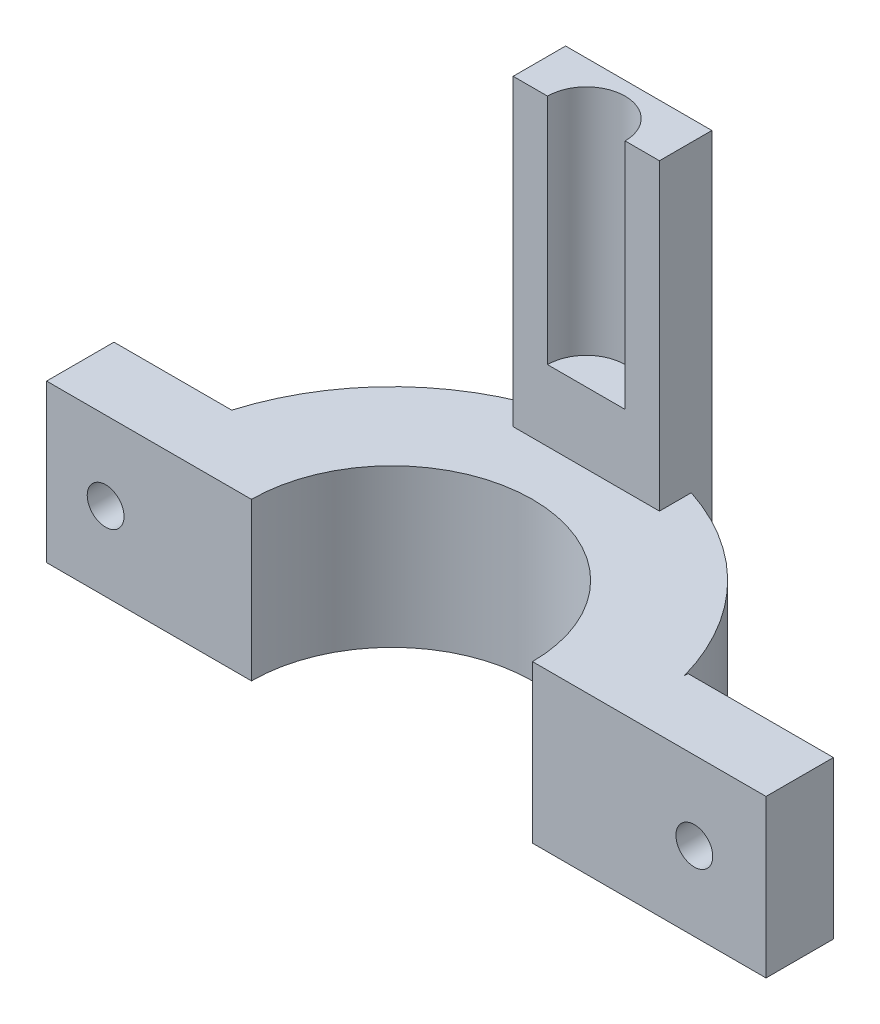
ISO-10303-21;
HEADER;
FILE_DESCRIPTION(('STEP AP214'),'2;1');
FILE_NAME('part.step','',(''),(''),'','','');
FILE_SCHEMA(('AUTOMOTIVE_DESIGN { 1 0 10303 214 1 1 1 1 }'));
ENDSEC;
DATA;
#1=APPLICATION_CONTEXT('core data for automotive mechanical design processes');
#2=APPLICATION_PROTOCOL_DEFINITION('international standard','automotive_design',2000,#1);
#3=PRODUCT_CONTEXT('',#1,'mechanical');
#4=PRODUCT('Part','Part','',(#3));
#5=PRODUCT_RELATED_PRODUCT_CATEGORY('part','',(#4));
#6=PRODUCT_DEFINITION_FORMATION('','',#4);
#7=PRODUCT_DEFINITION_CONTEXT('part definition',#1,'design');
#8=PRODUCT_DEFINITION('design','',#6,#7);
#9=PRODUCT_DEFINITION_SHAPE('','',#8);
#10=(LENGTH_UNIT() NAMED_UNIT(*) SI_UNIT(.MILLI.,.METRE.));
#11=(NAMED_UNIT(*) PLANE_ANGLE_UNIT() SI_UNIT($,.RADIAN.));
#12=(NAMED_UNIT(*) SI_UNIT($,.STERADIAN.) SOLID_ANGLE_UNIT());
#13=UNCERTAINTY_MEASURE_WITH_UNIT(LENGTH_MEASURE(1.E-05),#10,'distance_accuracy_value','');
#14=(GEOMETRIC_REPRESENTATION_CONTEXT(3) GLOBAL_UNCERTAINTY_ASSIGNED_CONTEXT((#13)) GLOBAL_UNIT_ASSIGNED_CONTEXT((#10,
#11,#12)) REPRESENTATION_CONTEXT('',''));
#15=CARTESIAN_POINT('',(0.,0.,0.));
#16=DIRECTION('',(0.,0.,1.));
#17=DIRECTION('',(1.,0.,0.));
#18=AXIS2_PLACEMENT_3D('',#15,#16,#17);
#19=CARTESIAN_POINT('',(-27.351479578733,-58.59,0.));
#20=DIRECTION('',(0.,-1.,0.));
#21=DIRECTION('',(0.,0.,-1.));
#22=AXIS2_PLACEMENT_3D('',#19,#20,#21);
#23=CYLINDRICAL_SURFACE('',#22,24.5);
#24=CARTESIAN_POINT('',(-27.351479578733,-69.769427919111,0.));
#25=DIRECTION('',(0.,1.,0.));
#26=DIRECTION('',(0.,0.,1.));
#27=AXIS2_PLACEMENT_3D('',#24,#25,#26);
#28=CIRCLE('',#27,24.5);
#29=CARTESIAN_POINT('',(-34.8435628196889,-69.769427919111,-23.3263518088575));
#30=VERTEX_POINT('',#29);
#31=CARTESIAN_POINT('',(-19.745,-69.769427919111,-23.2892994402648));
#32=VERTEX_POINT('',#31);
#33=EDGE_CURVE('E312',#30,#32,#28,.F.);
#34=ORIENTED_EDGE('',*,*,#33,.T.);
#35=DIRECTION('',(0.,-1.,0.));
#36=VECTOR('',#35,1.);
#37=CARTESIAN_POINT('',(-19.745,-58.59,-23.2892994402648));
#38=LINE('',#37,#36);
#39=CARTESIAN_POINT('',(-19.745,-58.59,-23.2892994402648));
#40=VERTEX_POINT('',#39);
#41=EDGE_CURVE('E215',#32,#40,#38,.F.);
#42=ORIENTED_EDGE('',*,*,#41,.T.);
#43=CARTESIAN_POINT('',(-27.351479578733,-58.59,0.));
#44=DIRECTION('',(0.,-1.,0.));
#45=DIRECTION('',(1.,0.,0.));
#46=AXIS2_PLACEMENT_3D('',#43,#44,#45);
#47=CIRCLE('',#46,24.5);
#48=CARTESIAN_POINT('',(-3.74499999999999,-58.59,-6.55622771865516));
#49=VERTEX_POINT('',#48);
#50=EDGE_CURVE('E217',#40,#49,#47,.T.);
#51=ORIENTED_EDGE('',*,*,#50,.T.);
#52=DIRECTION('',(0.,-1.,0.));
#53=VECTOR('',#52,1.);
#54=CARTESIAN_POINT('',(-3.745,-58.59,-6.55622771865516));
#55=LINE('',#54,#53);
#56=CARTESIAN_POINT('',(-3.74499999999999,-74.82,-6.55622771865516));
#57=VERTEX_POINT('',#56);
#58=EDGE_CURVE('E232',#57,#49,#55,.F.);
#59=ORIENTED_EDGE('',*,*,#58,.F.);
#60=CARTESIAN_POINT('',(-27.351479578733,-74.82,0.));
#61=DIRECTION('',(0.,-1.,0.));
#62=DIRECTION('',(1.,0.,0.));
#63=AXIS2_PLACEMENT_3D('',#60,#61,#62);
#64=CIRCLE('',#63,24.5);
#65=CARTESIAN_POINT('',(-50.8435628196889,-74.82,-6.95500000000001));
#66=VERTEX_POINT('',#65);
#67=EDGE_CURVE('E241',#66,#57,#64,.T.);
#68=ORIENTED_EDGE('',*,*,#67,.F.);
#69=DIRECTION('',(0.,-1.,0.));
#70=VECTOR('',#69,1.);
#71=CARTESIAN_POINT('',(-50.8435628196889,-58.59,-6.95500000000001));
#72=LINE('',#71,#70);
#73=CARTESIAN_POINT('',(-50.8435628196889,-58.59,-6.95500000000001));
#74=VERTEX_POINT('',#73);
#75=EDGE_CURVE('E227',#74,#66,#72,.T.);
#76=ORIENTED_EDGE('',*,*,#75,.F.);
#77=CARTESIAN_POINT('',(-34.8435628196889,-58.59,-23.3263518088575));
#78=VERTEX_POINT('',#77);
#79=EDGE_CURVE('E258',#74,#78,#47,.T.);
#80=ORIENTED_EDGE('',*,*,#79,.T.);
#81=DIRECTION('',(0.,-1.,0.));
#82=VECTOR('',#81,1.);
#83=CARTESIAN_POINT('',(-34.8435628196889,-58.59,-23.3263518088575));
#84=LINE('',#83,#82);
#85=EDGE_CURVE('E208',#78,#30,#84,.T.);
#86=ORIENTED_EDGE('',*,*,#85,.T.);
#87=EDGE_LOOP('',(#34,#42,#51,#59,#68,#76,#80,#86));
#88=FACE_BOUND('',#87,.T.);
#89=ADVANCED_FACE('F65',(#88),#23,.T.);
#90=CARTESIAN_POINT('',(-3.74499999999999,-58.59,-6.95500000000001));
#91=DIRECTION('',(0.,-1.,0.));
#92=DIRECTION('',(0.,0.,-1.));
#93=AXIS2_PLACEMENT_3D('',#90,#91,#92);
#94=PLANE('',#93);
#95=DIRECTION('',(0.,0.,-1.));
#96=VECTOR('',#95,1.);
#97=CARTESIAN_POINT('',(-19.745,-58.59,-6.95500000000001));
#98=LINE('',#97,#96);
#99=CARTESIAN_POINT('',(-19.745,-58.59,-20.));
#100=VERTEX_POINT('',#99);
#101=EDGE_CURVE('E309',#100,#40,#98,.T.);
#102=ORIENTED_EDGE('',*,*,#101,.F.);
#103=DIRECTION('',(1.,0.,0.));
#104=VECTOR('',#103,1.);
#105=CARTESIAN_POINT('',(-3.74499999999999,-58.59,-20.));
#106=LINE('',#105,#104);
#107=CARTESIAN_POINT('',(-34.8435628196889,-58.59,-20.));
#108=VERTEX_POINT('',#107);
#109=EDGE_CURVE('E221',#108,#100,#106,.T.);
#110=ORIENTED_EDGE('',*,*,#109,.F.);
#111=DIRECTION('',(0.,0.,1.));
#112=VECTOR('',#111,1.);
#113=CARTESIAN_POINT('',(-34.8435628196889,-58.59,-6.95500000000001));
#114=LINE('',#113,#112);
#115=EDGE_CURVE('E307',#78,#108,#114,.T.);
#116=ORIENTED_EDGE('',*,*,#115,.F.);
#117=ORIENTED_EDGE('',*,*,#79,.F.);
#118=DIRECTION('',(1.,0.,0.));
#119=VECTOR('',#118,1.);
#120=CARTESIAN_POINT('',(-63.,-58.59,-6.95500000000001));
#121=LINE('',#120,#119);
#122=CARTESIAN_POINT('',(-63.,-58.59,-6.95500000000001));
#123=VERTEX_POINT('',#122);
#124=EDGE_CURVE('E231',#123,#74,#121,.T.);
#125=ORIENTED_EDGE('',*,*,#124,.F.);
#126=DIRECTION('',(0.,0.,1.));
#127=VECTOR('',#126,1.);
#128=CARTESIAN_POINT('',(-63.,-58.59,-6.95500000000001));
#129=LINE('',#128,#127);
#130=CARTESIAN_POINT('',(-63.,-58.59,0.));
#131=VERTEX_POINT('',#130);
#132=EDGE_CURVE('E280',#123,#131,#129,.T.);
#133=ORIENTED_EDGE('',*,*,#132,.T.);
#134=DIRECTION('',(1.,0.,0.));
#135=VECTOR('',#134,1.);
#136=CARTESIAN_POINT('',(-3.74499999999999,-58.59,0.));
#137=LINE('',#136,#135);
#138=CARTESIAN_POINT('',(-41.851479578733,-58.59,0.));
#139=VERTEX_POINT('',#138);
#140=EDGE_CURVE('E268',#131,#139,#137,.T.);
#141=ORIENTED_EDGE('',*,*,#140,.T.);
#142=CARTESIAN_POINT('',(-27.351479578733,-58.59,0.));
#143=DIRECTION('',(0.,-1.,0.));
#144=DIRECTION('',(0.,0.,-1.));
#145=AXIS2_PLACEMENT_3D('',#142,#143,#144);
#146=CIRCLE('',#145,14.5);
#147=CARTESIAN_POINT('',(-12.851479578733,-58.59,0.));
#148=VERTEX_POINT('',#147);
#149=EDGE_CURVE('E265',#139,#148,#146,.T.);
#150=ORIENTED_EDGE('',*,*,#149,.T.);
#151=CARTESIAN_POINT('',(11.255,-58.59,0.));
#152=VERTEX_POINT('',#151);
#153=EDGE_CURVE('E248',#148,#152,#137,.T.);
#154=ORIENTED_EDGE('',*,*,#153,.T.);
#155=DIRECTION('',(0.,0.,-1.));
#156=VECTOR('',#155,1.);
#157=CARTESIAN_POINT('',(11.255,-58.59,-6.955));
#158=LINE('',#157,#156);
#159=CARTESIAN_POINT('',(11.255,-58.59,-6.955));
#160=VERTEX_POINT('',#159);
#161=EDGE_CURVE('E245',#152,#160,#158,.T.);
#162=ORIENTED_EDGE('',*,*,#161,.T.);
#163=DIRECTION('',(1.,0.,0.));
#164=VECTOR('',#163,1.);
#165=CARTESIAN_POINT('',(-3.74499999999999,-58.59,-6.95500000000001));
#166=LINE('',#165,#164);
#167=CARTESIAN_POINT('',(-3.74499999999999,-58.59,-6.95500000000001));
#168=VERTEX_POINT('',#167);
#169=EDGE_CURVE('E240',#168,#160,#166,.T.);
#170=ORIENTED_EDGE('',*,*,#169,.F.);
#171=DIRECTION('',(0.,0.,-1.));
#172=VECTOR('',#171,1.);
#173=CARTESIAN_POINT('',(-3.74499999999999,-58.59,-6.95500000000001));
#174=LINE('',#173,#172);
#175=EDGE_CURVE('E235',#49,#168,#174,.T.);
#176=ORIENTED_EDGE('',*,*,#175,.F.);
#177=ORIENTED_EDGE('',*,*,#50,.F.);
#178=EDGE_LOOP('',(#102,#110,#116,#117,#125,#133,#141,#150,#154,#162,#170,#176,#177));
#179=FACE_BOUND('',#178,.T.);
#180=ADVANCED_FACE('F347',(#179),#94,.F.);
#181=CARTESIAN_POINT('',(0.,-74.82,0.));
#182=DIRECTION('',(0.,-1.,0.));
#183=DIRECTION('',(0.,0.,-1.));
#184=AXIS2_PLACEMENT_3D('',#181,#182,#183);
#185=PLANE('',#184);
#186=DIRECTION('',(0.,0.,1.));
#187=VECTOR('',#186,1.);
#188=CARTESIAN_POINT('',(11.255,-74.82,-27.));
#189=LINE('',#188,#187);
#190=CARTESIAN_POINT('',(11.255,-74.82,-6.955));
#191=VERTEX_POINT('',#190);
#192=CARTESIAN_POINT('',(11.255,-74.82,0.));
#193=VERTEX_POINT('',#192);
#194=EDGE_CURVE('E261',#191,#193,#189,.T.);
#195=ORIENTED_EDGE('',*,*,#194,.T.);
#196=DIRECTION('',(-1.,0.,0.));
#197=VECTOR('',#196,1.);
#198=CARTESIAN_POINT('',(-63.,-74.82,0.));
#199=LINE('',#198,#197);
#200=CARTESIAN_POINT('',(-12.851479578733,-74.82,0.));
#201=VERTEX_POINT('',#200);
#202=EDGE_CURVE('E300',#193,#201,#199,.T.);
#203=ORIENTED_EDGE('',*,*,#202,.T.);
#204=CARTESIAN_POINT('',(-27.351479578733,-74.82,0.));
#205=DIRECTION('',(0.,-1.,0.));
#206=DIRECTION('',(0.,0.,-1.));
#207=AXIS2_PLACEMENT_3D('',#204,#205,#206);
#208=CIRCLE('',#207,14.5);
#209=CARTESIAN_POINT('',(-41.851479578733,-74.82,0.));
#210=VERTEX_POINT('',#209);
#211=EDGE_CURVE('E255',#210,#201,#208,.T.);
#212=ORIENTED_EDGE('',*,*,#211,.F.);
#213=CARTESIAN_POINT('',(-63.,-74.82,0.));
#214=VERTEX_POINT('',#213);
#215=EDGE_CURVE('E279',#210,#214,#199,.T.);
#216=ORIENTED_EDGE('',*,*,#215,.T.);
#217=DIRECTION('',(0.,0.,-1.));
#218=VECTOR('',#217,1.);
#219=CARTESIAN_POINT('',(-63.,-74.82,-6.95500000000001));
#220=LINE('',#219,#218);
#221=CARTESIAN_POINT('',(-63.,-74.82,-6.95500000000001));
#222=VERTEX_POINT('',#221);
#223=EDGE_CURVE('E277',#214,#222,#220,.T.);
#224=ORIENTED_EDGE('',*,*,#223,.T.);
#225=DIRECTION('',(1.,0.,0.));
#226=VECTOR('',#225,1.);
#227=CARTESIAN_POINT('',(-63.,-74.82,-6.95500000000001));
#228=LINE('',#227,#226);
#229=EDGE_CURVE('E257',#222,#66,#228,.T.);
#230=ORIENTED_EDGE('',*,*,#229,.T.);
#231=ORIENTED_EDGE('',*,*,#67,.T.);
#232=DIRECTION('',(0.,0.,1.));
#233=VECTOR('',#232,1.);
#234=CARTESIAN_POINT('',(-3.74499999999999,-74.82,-6.95500000000001));
#235=LINE('',#234,#233);
#236=CARTESIAN_POINT('',(-3.74499999999999,-74.82,-6.95500000000001));
#237=VERTEX_POINT('',#236);
#238=EDGE_CURVE('E236',#237,#57,#235,.T.);
#239=ORIENTED_EDGE('',*,*,#238,.F.);
#240=DIRECTION('',(1.,0.,0.));
#241=VECTOR('',#240,1.);
#242=CARTESIAN_POINT('',(11.255,-74.82,-6.955));
#243=LINE('',#242,#241);
#244=EDGE_CURVE('E237',#237,#191,#243,.T.);
#245=ORIENTED_EDGE('',*,*,#244,.T.);
#246=EDGE_LOOP('',(#195,#203,#212,#216,#224,#230,#231,#239,#245));
#247=FACE_BOUND('',#246,.T.);
#248=ADVANCED_FACE('F359',(#247),#185,.T.);
#249=CARTESIAN_POINT('',(11.255,-74.82,-6.955));
#250=DIRECTION('',(0.,0.,1.));
#251=DIRECTION('',(1.,0.,0.));
#252=AXIS2_PLACEMENT_3D('',#249,#250,#251);
#253=PLANE('',#252);
#254=CARTESIAN_POINT('',(3.85671364878704,-66.705,-6.955));
#255=DIRECTION('',(0.,0.,-1.));
#256=DIRECTION('',(-1.,0.,0.));
#257=AXIS2_PLACEMENT_3D('',#254,#255,#256);
#258=CIRCLE('',#257,1.9);
#259=CARTESIAN_POINT('',(1.95671364878704,-66.705,-6.955));
#260=VERTEX_POINT('',#259);
#261=EDGE_CURVE('E269',#260,#260,#258,.T.);
#262=ORIENTED_EDGE('',*,*,#261,.F.);
#263=EDGE_LOOP('',(#262));
#264=FACE_BOUND('',#263,.T.);
#265=ORIENTED_EDGE('',*,*,#169,.T.);
#266=DIRECTION('',(0.,-1.,0.));
#267=VECTOR('',#266,1.);
#268=CARTESIAN_POINT('',(11.255,-74.82,-6.955));
#269=LINE('',#268,#267);
#270=EDGE_CURVE('E244',#160,#191,#269,.T.);
#271=ORIENTED_EDGE('',*,*,#270,.T.);
#272=ORIENTED_EDGE('',*,*,#244,.F.);
#273=DIRECTION('',(0.,-1.,0.));
#274=VECTOR('',#273,1.);
#275=CARTESIAN_POINT('',(-3.74499999999999,-74.82,-6.95500000000001));
#276=LINE('',#275,#274);
#277=EDGE_CURVE('E250',#168,#237,#276,.T.);
#278=ORIENTED_EDGE('',*,*,#277,.F.);
#279=EDGE_LOOP('',(#265,#271,#272,#278));
#280=FACE_BOUND('',#279,.T.);
#281=ADVANCED_FACE('F379',(#264,#280),#253,.F.);
#282=CARTESIAN_POINT('',(-3.745,0.,0.));
#283=DIRECTION('',(1.,0.,0.));
#284=DIRECTION('',(0.,0.,-1.));
#285=AXIS2_PLACEMENT_3D('',#282,#283,#284);
#286=PLANE('',#285);
#287=ORIENTED_EDGE('',*,*,#238,.T.);
#288=ORIENTED_EDGE('',*,*,#58,.T.);
#289=ORIENTED_EDGE('',*,*,#175,.T.);
#290=ORIENTED_EDGE('',*,*,#277,.T.);
#291=EDGE_LOOP('',(#287,#288,#289,#290));
#292=FACE_BOUND('',#291,.T.);
#293=ADVANCED_FACE('F355',(#292),#286,.F.);
#294=CARTESIAN_POINT('',(-27.351479578733,-58.59,0.));
#295=DIRECTION('',(0.,-1.,0.));
#296=DIRECTION('',(0.,0.,-1.));
#297=AXIS2_PLACEMENT_3D('',#294,#295,#296);
#298=CYLINDRICAL_SURFACE('',#297,14.5);
#299=ORIENTED_EDGE('',*,*,#211,.T.);
#300=DIRECTION('',(0.,-1.,0.));
#301=VECTOR('',#300,1.);
#302=CARTESIAN_POINT('',(-12.851479578733,-58.59,0.));
#303=LINE('',#302,#301);
#304=EDGE_CURVE('E264',#201,#148,#303,.F.);
#305=ORIENTED_EDGE('',*,*,#304,.T.);
#306=ORIENTED_EDGE('',*,*,#149,.F.);
#307=DIRECTION('',(0.,-1.,0.));
#308=VECTOR('',#307,1.);
#309=CARTESIAN_POINT('',(-41.851479578733,-58.59,0.));
#310=LINE('',#309,#308);
#311=EDGE_CURVE('E289',#139,#210,#310,.T.);
#312=ORIENTED_EDGE('',*,*,#311,.T.);
#313=EDGE_LOOP('',(#299,#305,#306,#312));
#314=FACE_BOUND('',#313,.T.);
#315=ADVANCED_FACE('F371',(#314),#298,.F.);
#316=CARTESIAN_POINT('',(3.85671364878704,-66.705,24.5));
#317=DIRECTION('',(0.,0.,-1.));
#318=DIRECTION('',(-1.,0.,0.));
#319=AXIS2_PLACEMENT_3D('',#316,#317,#318);
#320=CYLINDRICAL_SURFACE('',#319,1.9);
#321=CARTESIAN_POINT('',(3.85671364878704,-66.705,0.));
#322=DIRECTION('',(0.,0.,-1.));
#323=DIRECTION('',(-1.,0.,0.));
#324=AXIS2_PLACEMENT_3D('',#321,#322,#323);
#325=CIRCLE('',#324,1.9);
#326=CARTESIAN_POINT('',(1.95671364878704,-66.705,0.));
#327=VERTEX_POINT('',#326);
#328=EDGE_CURVE('E272',#327,#327,#325,.F.);
#329=ORIENTED_EDGE('',*,*,#328,.T.);
#330=EDGE_LOOP('',(#329));
#331=FACE_BOUND('',#330,.T.);
#332=ORIENTED_EDGE('',*,*,#261,.T.);
#333=EDGE_LOOP('',(#332));
#334=FACE_BOUND('',#333,.T.);
#335=ADVANCED_FACE('F404',(#331,#334),#320,.F.);
#336=CARTESIAN_POINT('',(-63.,-58.59,-6.95500000000001));
#337=DIRECTION('',(0.,0.,-1.));
#338=DIRECTION('',(-1.,0.,0.));
#339=AXIS2_PLACEMENT_3D('',#336,#337,#338);
#340=PLANE('',#339);
#341=CARTESIAN_POINT('',(-56.9080400165376,-66.705,-6.95500000000001));
#342=DIRECTION('',(0.,0.,-1.));
#343=DIRECTION('',(-1.,0.,0.));
#344=AXIS2_PLACEMENT_3D('',#341,#342,#343);
#345=CIRCLE('',#344,1.9);
#346=CARTESIAN_POINT('',(-58.8080400165376,-66.705,-6.95500000000001));
#347=VERTEX_POINT('',#346);
#348=EDGE_CURVE('E222',#347,#347,#345,.T.);
#349=ORIENTED_EDGE('',*,*,#348,.F.);
#350=EDGE_LOOP('',(#349));
#351=FACE_BOUND('',#350,.T.);
#352=ORIENTED_EDGE('',*,*,#124,.T.);
#353=ORIENTED_EDGE('',*,*,#75,.T.);
#354=ORIENTED_EDGE('',*,*,#229,.F.);
#355=DIRECTION('',(0.,1.,0.));
#356=VECTOR('',#355,1.);
#357=CARTESIAN_POINT('',(-63.,-58.59,-6.95500000000001));
#358=LINE('',#357,#356);
#359=EDGE_CURVE('E230',#222,#123,#358,.T.);
#360=ORIENTED_EDGE('',*,*,#359,.T.);
#361=EDGE_LOOP('',(#352,#353,#354,#360));
#362=FACE_BOUND('',#361,.T.);
#363=ADVANCED_FACE('F362',(#351,#362),#340,.T.);
#364=CARTESIAN_POINT('',(-63.,0.,0.));
#365=DIRECTION('',(-1.,0.,0.));
#366=DIRECTION('',(0.,0.,1.));
#367=AXIS2_PLACEMENT_3D('',#364,#365,#366);
#368=PLANE('',#367);
#369=DIRECTION('',(0.,1.,0.));
#370=VECTOR('',#369,1.);
#371=CARTESIAN_POINT('',(-63.,-74.82,0.));
#372=LINE('',#371,#370);
#373=EDGE_CURVE('E226',#214,#131,#372,.T.);
#374=ORIENTED_EDGE('',*,*,#373,.T.);
#375=ORIENTED_EDGE('',*,*,#132,.F.);
#376=ORIENTED_EDGE('',*,*,#359,.F.);
#377=ORIENTED_EDGE('',*,*,#223,.F.);
#378=EDGE_LOOP('',(#374,#375,#376,#377));
#379=FACE_BOUND('',#378,.T.);
#380=ADVANCED_FACE('F366',(#379),#368,.T.);
#381=CARTESIAN_POINT('',(-56.9080400165376,-66.705,24.5));
#382=DIRECTION('',(0.,0.,-1.));
#383=DIRECTION('',(-1.,0.,0.));
#384=AXIS2_PLACEMENT_3D('',#381,#382,#383);
#385=CYLINDRICAL_SURFACE('',#384,1.9);
#386=CARTESIAN_POINT('',(-56.9080400165376,-66.705,0.));
#387=DIRECTION('',(0.,0.,-1.));
#388=DIRECTION('',(-1.,0.,0.));
#389=AXIS2_PLACEMENT_3D('',#386,#387,#388);
#390=CIRCLE('',#389,1.9);
#391=CARTESIAN_POINT('',(-58.8080400165376,-66.705,0.));
#392=VERTEX_POINT('',#391);
#393=EDGE_CURVE('E223',#392,#392,#390,.F.);
#394=ORIENTED_EDGE('',*,*,#393,.T.);
#395=EDGE_LOOP('',(#394));
#396=FACE_BOUND('',#395,.T.);
#397=ORIENTED_EDGE('',*,*,#348,.T.);
#398=EDGE_LOOP('',(#397));
#399=FACE_BOUND('',#398,.T.);
#400=ADVANCED_FACE('F382',(#396,#399),#385,.F.);
#401=CARTESIAN_POINT('',(-63.,-74.82,0.));
#402=DIRECTION('',(0.,0.,-1.));
#403=DIRECTION('',(-1.,0.,0.));
#404=AXIS2_PLACEMENT_3D('',#401,#402,#403);
#405=PLANE('',#404);
#406=ORIENTED_EDGE('',*,*,#393,.F.);
#407=EDGE_LOOP('',(#406));
#408=FACE_BOUND('',#407,.T.);
#409=ORIENTED_EDGE('',*,*,#373,.F.);
#410=ORIENTED_EDGE('',*,*,#215,.F.);
#411=ORIENTED_EDGE('',*,*,#311,.F.);
#412=ORIENTED_EDGE('',*,*,#140,.F.);
#413=EDGE_LOOP('',(#409,#410,#411,#412));
#414=FACE_BOUND('',#413,.T.);
#415=ADVANCED_FACE('F380',(#408,#414),#405,.F.);
#416=ORIENTED_EDGE('',*,*,#328,.F.);
#417=EDGE_LOOP('',(#416));
#418=FACE_BOUND('',#417,.T.);
#419=ORIENTED_EDGE('',*,*,#202,.F.);
#420=DIRECTION('',(0.,1.,0.));
#421=VECTOR('',#420,1.);
#422=CARTESIAN_POINT('',(11.255,-74.82,0.));
#423=LINE('',#422,#421);
#424=EDGE_CURVE('E218',#193,#152,#423,.T.);
#425=ORIENTED_EDGE('',*,*,#424,.T.);
#426=ORIENTED_EDGE('',*,*,#153,.F.);
#427=ORIENTED_EDGE('',*,*,#304,.F.);
#428=EDGE_LOOP('',(#419,#425,#426,#427));
#429=FACE_BOUND('',#428,.T.);
#430=ADVANCED_FACE('F376',(#418,#429),#405,.F.);
#431=CARTESIAN_POINT('',(11.255,-74.82,-27.));
#432=DIRECTION('',(-1.,0.,0.));
#433=DIRECTION('',(0.,0.,1.));
#434=AXIS2_PLACEMENT_3D('',#431,#432,#433);
#435=PLANE('',#434);
#436=ORIENTED_EDGE('',*,*,#161,.F.);
#437=ORIENTED_EDGE('',*,*,#424,.F.);
#438=ORIENTED_EDGE('',*,*,#194,.F.);
#439=ORIENTED_EDGE('',*,*,#270,.F.);
#440=EDGE_LOOP('',(#436,#437,#438,#439));
#441=FACE_BOUND('',#440,.T.);
#442=ADVANCED_FACE('F67',(#441),#435,.F.);
#443=CARTESIAN_POINT('',(0.,0.,-20.));
#444=DIRECTION('',(0.,0.,-1.));
#445=DIRECTION('',(-1.,0.,0.));
#446=AXIS2_PLACEMENT_3D('',#443,#444,#445);
#447=PLANE('',#446);
#448=DIRECTION('',(1.,0.,0.));
#449=VECTOR('',#448,1.);
#450=CARTESIAN_POINT('',(0.,-51.269427919111,-20.));
#451=LINE('',#450,#449);
#452=CARTESIAN_POINT('',(-31.2992814098444,-51.269427919111,-20.));
#453=VERTEX_POINT('',#452);
#454=CARTESIAN_POINT('',(-23.2892814098444,-51.269427919111,-20.));
#455=VERTEX_POINT('',#454);
#456=EDGE_CURVE('E73',#453,#455,#451,.T.);
#457=ORIENTED_EDGE('',*,*,#456,.F.);
#458=DIRECTION('',(0.,1.,0.));
#459=VECTOR('',#458,1.);
#460=CARTESIAN_POINT('',(-31.2992814098444,-51.269427919111,-20.));
#461=LINE('',#460,#459);
#462=CARTESIAN_POINT('',(-31.2992814098444,-27.269427919111,-20.));
#463=VERTEX_POINT('',#462);
#464=EDGE_CURVE('E323',#453,#463,#461,.T.);
#465=ORIENTED_EDGE('',*,*,#464,.T.);
#466=DIRECTION('',(-1.,0.,0.));
#467=VECTOR('',#466,1.);
#468=CARTESIAN_POINT('',(-19.745,-27.269427919111,-20.));
#469=LINE('',#468,#467);
#470=CARTESIAN_POINT('',(-34.8435628196889,-27.269427919111,-20.));
#471=VERTEX_POINT('',#470);
#472=EDGE_CURVE('E333',#463,#471,#469,.T.);
#473=ORIENTED_EDGE('',*,*,#472,.T.);
#474=DIRECTION('',(0.,-1.,0.));
#475=VECTOR('',#474,1.);
#476=CARTESIAN_POINT('',(-34.8435628196889,-27.269427919111,-20.));
#477=LINE('',#476,#475);
#478=EDGE_CURVE('E205',#471,#108,#477,.T.);
#479=ORIENTED_EDGE('',*,*,#478,.T.);
#480=ORIENTED_EDGE('',*,*,#109,.T.);
#481=DIRECTION('',(0.,1.,0.));
#482=VECTOR('',#481,1.);
#483=CARTESIAN_POINT('',(-19.745,-27.269427919111,-20.));
#484=LINE('',#483,#482);
#485=CARTESIAN_POINT('',(-19.745,-27.269427919111,-20.));
#486=VERTEX_POINT('',#485);
#487=EDGE_CURVE('E329',#100,#486,#484,.T.);
#488=ORIENTED_EDGE('',*,*,#487,.T.);
#489=CARTESIAN_POINT('',(-23.2892814098444,-27.269427919111,-20.));
#490=VERTEX_POINT('',#489);
#491=EDGE_CURVE('E327',#486,#490,#469,.T.);
#492=ORIENTED_EDGE('',*,*,#491,.T.);
#493=DIRECTION('',(0.,1.,0.));
#494=VECTOR('',#493,1.);
#495=CARTESIAN_POINT('',(-23.2892814098444,-51.269427919111,-20.));
#496=LINE('',#495,#494);
#497=EDGE_CURVE('E87',#490,#455,#496,.F.);
#498=ORIENTED_EDGE('',*,*,#497,.T.);
#499=EDGE_LOOP('',(#457,#465,#473,#479,#480,#488,#492,#498));
#500=FACE_BOUND('',#499,.T.);
#501=ADVANCED_FACE('F326',(#500),#447,.F.);
#502=CARTESIAN_POINT('',(-19.745,-27.269427919111,-20.));
#503=DIRECTION('',(-1.,0.,0.));
#504=DIRECTION('',(0.,-1.,0.));
#505=AXIS2_PLACEMENT_3D('',#502,#503,#504);
#506=PLANE('',#505);
#507=DIRECTION('',(0.,0.,-1.));
#508=VECTOR('',#507,1.);
#509=CARTESIAN_POINT('',(-19.745,-69.769427919111,-20.));
#510=LINE('',#509,#508);
#511=CARTESIAN_POINT('',(-19.745,-69.769427919111,-25.4125470813138));
#512=VERTEX_POINT('',#511);
#513=EDGE_CURVE('E210',#32,#512,#510,.T.);
#514=ORIENTED_EDGE('',*,*,#513,.T.);
#515=DIRECTION('',(0.,1.,0.));
#516=VECTOR('',#515,1.);
#517=CARTESIAN_POINT('',(-19.745,-74.82,-25.4125470813138));
#518=LINE('',#517,#516);
#519=CARTESIAN_POINT('',(-19.745,-27.269427919111,-25.4125470813138));
#520=VERTEX_POINT('',#519);
#521=EDGE_CURVE('E80',#512,#520,#518,.T.);
#522=ORIENTED_EDGE('',*,*,#521,.T.);
#523=DIRECTION('',(0.,0.,-1.));
#524=VECTOR('',#523,1.);
#525=CARTESIAN_POINT('',(-19.745,-27.269427919111,-20.));
#526=LINE('',#525,#524);
#527=EDGE_CURVE('E200',#486,#520,#526,.T.);
#528=ORIENTED_EDGE('',*,*,#527,.F.);
#529=ORIENTED_EDGE('',*,*,#487,.F.);
#530=ORIENTED_EDGE('',*,*,#101,.T.);
#531=ORIENTED_EDGE('',*,*,#41,.F.);
#532=EDGE_LOOP('',(#514,#522,#528,#529,#530,#531));
#533=FACE_BOUND('',#532,.T.);
#534=ADVANCED_FACE('F339',(#533),#506,.F.);
#535=CARTESIAN_POINT('',(-19.745,-27.269427919111,-20.));
#536=DIRECTION('',(0.,-1.,0.));
#537=DIRECTION('',(1.,0.,0.));
#538=AXIS2_PLACEMENT_3D('',#535,#536,#537);
#539=PLANE('',#538);
#540=ORIENTED_EDGE('',*,*,#527,.T.);
#541=DIRECTION('',(1.,0.,0.));
#542=VECTOR('',#541,1.);
#543=CARTESIAN_POINT('',(-34.8435628196889,-27.269427919111,-25.4125470813138));
#544=LINE('',#543,#542);
#545=CARTESIAN_POINT('',(-34.8435628196889,-27.269427919111,-25.4125470813138));
#546=VERTEX_POINT('',#545);
#547=EDGE_CURVE('E185',#546,#520,#544,.T.);
#548=ORIENTED_EDGE('',*,*,#547,.F.);
#549=DIRECTION('',(0.,0.,-1.));
#550=VECTOR('',#549,1.);
#551=CARTESIAN_POINT('',(-34.8435628196889,-27.269427919111,-20.));
#552=LINE('',#551,#550);
#553=EDGE_CURVE('E196',#471,#546,#552,.T.);
#554=ORIENTED_EDGE('',*,*,#553,.F.);
#555=ORIENTED_EDGE('',*,*,#472,.F.);
#556=CARTESIAN_POINT('',(-27.2942814098444,-27.269427919111,-20.));
#557=DIRECTION('',(0.,-1.,0.));
#558=DIRECTION('',(1.,0.,0.));
#559=AXIS2_PLACEMENT_3D('',#556,#557,#558);
#560=CIRCLE('',#559,4.005);
#561=EDGE_CURVE('E314',#463,#490,#560,.T.);
#562=ORIENTED_EDGE('',*,*,#561,.T.);
#563=ORIENTED_EDGE('',*,*,#491,.F.);
#564=EDGE_LOOP('',(#540,#548,#554,#555,#562,#563));
#565=FACE_BOUND('',#564,.T.);
#566=ADVANCED_FACE('F194',(#565),#539,.F.);
#567=CARTESIAN_POINT('',(-34.8435628196889,-27.269427919111,-20.));
#568=DIRECTION('',(1.,0.,0.));
#569=DIRECTION('',(0.,1.,0.));
#570=AXIS2_PLACEMENT_3D('',#567,#568,#569);
#571=PLANE('',#570);
#572=ORIENTED_EDGE('',*,*,#553,.T.);
#573=DIRECTION('',(0.,1.,0.));
#574=VECTOR('',#573,1.);
#575=CARTESIAN_POINT('',(-34.8435628196889,-74.82,-25.4125470813138));
#576=LINE('',#575,#574);
#577=CARTESIAN_POINT('',(-34.8435628196889,-69.769427919111,-25.4125470813138));
#578=VERTEX_POINT('',#577);
#579=EDGE_CURVE('E182',#578,#546,#576,.T.);
#580=ORIENTED_EDGE('',*,*,#579,.F.);
#581=DIRECTION('',(0.,0.,-1.));
#582=VECTOR('',#581,1.);
#583=CARTESIAN_POINT('',(-34.8435628196889,-69.769427919111,-20.));
#584=LINE('',#583,#582);
#585=EDGE_CURVE('E206',#30,#578,#584,.T.);
#586=ORIENTED_EDGE('',*,*,#585,.F.);
#587=ORIENTED_EDGE('',*,*,#85,.F.);
#588=ORIENTED_EDGE('',*,*,#115,.T.);
#589=ORIENTED_EDGE('',*,*,#478,.F.);
#590=EDGE_LOOP('',(#572,#580,#586,#587,#588,#589));
#591=FACE_BOUND('',#590,.T.);
#592=ADVANCED_FACE('F202',(#591),#571,.F.);
#593=CARTESIAN_POINT('',(-19.745,-69.769427919111,-20.));
#594=DIRECTION('',(0.,1.,0.));
#595=DIRECTION('',(0.,0.,1.));
#596=AXIS2_PLACEMENT_3D('',#593,#594,#595);
#597=PLANE('',#596);
#598=ORIENTED_EDGE('',*,*,#585,.T.);
#599=DIRECTION('',(1.,0.,0.));
#600=VECTOR('',#599,1.);
#601=CARTESIAN_POINT('',(-19.745,-69.769427919111,-25.4125470813138));
#602=LINE('',#601,#600);
#603=EDGE_CURVE('E12',#578,#512,#602,.T.);
#604=ORIENTED_EDGE('',*,*,#603,.T.);
#605=ORIENTED_EDGE('',*,*,#513,.F.);
#606=ORIENTED_EDGE('',*,*,#33,.F.);
#607=EDGE_LOOP('',(#598,#604,#605,#606));
#608=FACE_BOUND('',#607,.T.);
#609=ADVANCED_FACE('F342',(#608),#597,.F.);
#610=CARTESIAN_POINT('',(-27.2942814098444,-51.269427919111,-20.));
#611=DIRECTION('',(0.,1.,0.));
#612=DIRECTION('',(-1.,0.,0.));
#613=AXIS2_PLACEMENT_3D('',#610,#611,#612);
#614=PLANE('',#613);
#615=ORIENTED_EDGE('',*,*,#456,.T.);
#616=CARTESIAN_POINT('',(-27.2942814098444,-51.269427919111,-20.));
#617=DIRECTION('',(0.,1.,0.));
#618=DIRECTION('',(-1.,0.,0.));
#619=AXIS2_PLACEMENT_3D('',#616,#617,#618);
#620=CIRCLE('',#619,4.005);
#621=EDGE_CURVE('E319',#455,#453,#620,.T.);
#622=ORIENTED_EDGE('',*,*,#621,.T.);
#623=EDGE_LOOP('',(#615,#622));
#624=FACE_BOUND('',#623,.T.);
#625=ADVANCED_FACE('F318',(#624),#614,.T.);
#626=CARTESIAN_POINT('',(-27.2942814098444,-51.269427919111,-20.));
#627=DIRECTION('',(0.,1.,0.));
#628=DIRECTION('',(-1.,0.,0.));
#629=AXIS2_PLACEMENT_3D('',#626,#627,#628);
#630=CYLINDRICAL_SURFACE('',#629,4.005);
#631=ORIENTED_EDGE('',*,*,#621,.F.);
#632=ORIENTED_EDGE('',*,*,#497,.F.);
#633=ORIENTED_EDGE('',*,*,#561,.F.);
#634=ORIENTED_EDGE('',*,*,#464,.F.);
#635=EDGE_LOOP('',(#631,#632,#633,#634));
#636=FACE_BOUND('',#635,.T.);
#637=ADVANCED_FACE('F322',(#636),#630,.F.);
#638=CARTESIAN_POINT('',(-34.8435628196889,-74.82,-25.4125470813138));
#639=DIRECTION('',(0.,0.,1.));
#640=DIRECTION('',(1.,0.,0.));
#641=AXIS2_PLACEMENT_3D('',#638,#639,#640);
#642=PLANE('',#641);
#643=ORIENTED_EDGE('',*,*,#579,.T.);
#644=ORIENTED_EDGE('',*,*,#547,.T.);
#645=ORIENTED_EDGE('',*,*,#521,.F.);
#646=ORIENTED_EDGE('',*,*,#603,.F.);
#647=EDGE_LOOP('',(#643,#644,#645,#646));
#648=FACE_BOUND('',#647,.T.);
#649=ADVANCED_FACE('F184',(#648),#642,.F.);
#650=CLOSED_SHELL('',(#89,#180,#248,#281,#293,#315,#335,#363,#380,#400,#415,#430,#442,#501,#534,
#566,#592,#609,#625,#637,#649));
#651=MANIFOLD_SOLID_BREP('B2',#650);
#652=ADVANCED_BREP_SHAPE_REPRESENTATION('',(#18,#651),#14);
#653=SHAPE_DEFINITION_REPRESENTATION(#9,#652);
ENDSEC;
END-ISO-10303-21;
